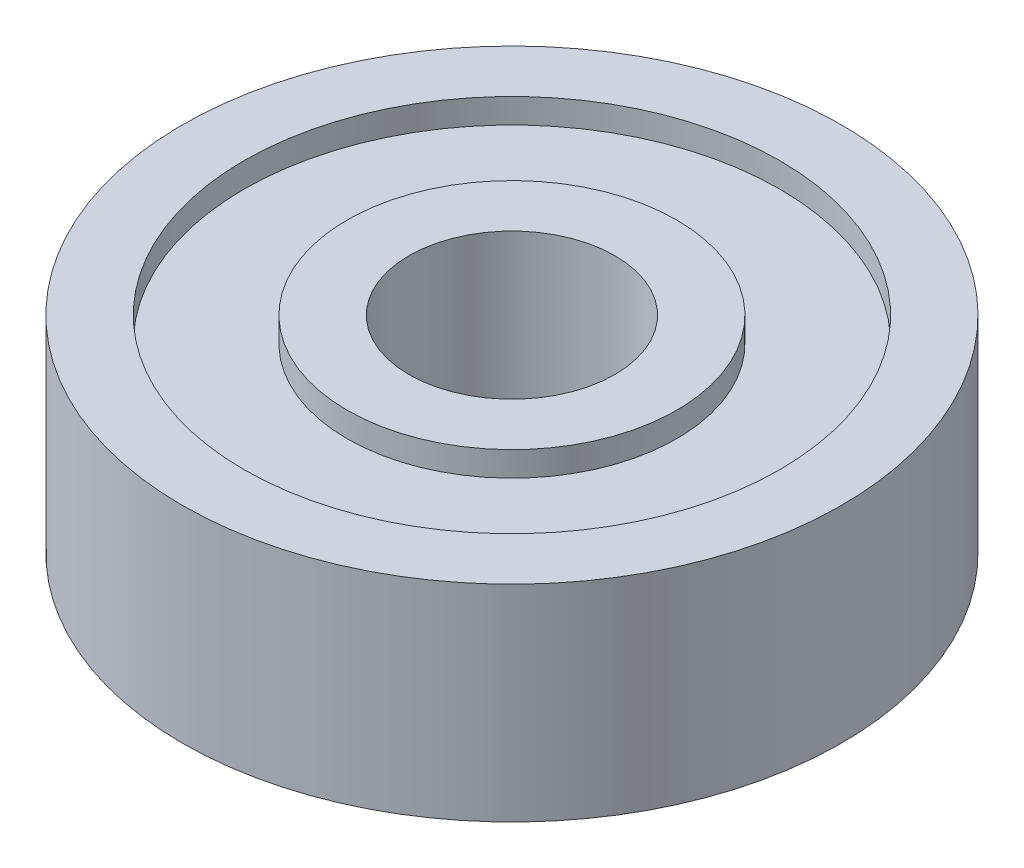
ISO-10303-21;
HEADER;
FILE_DESCRIPTION(('STEP AP214'),'2;1');
FILE_NAME('part.step','',(''),(''),'','','');
FILE_SCHEMA(('AUTOMOTIVE_DESIGN { 1 0 10303 214 1 1 1 1 }'));
ENDSEC;
DATA;
#1=APPLICATION_CONTEXT('core data for automotive mechanical design processes');
#2=APPLICATION_PROTOCOL_DEFINITION('international standard','automotive_design',2000,#1);
#3=PRODUCT_CONTEXT('',#1,'mechanical');
#4=PRODUCT('Part','Part','',(#3));
#5=PRODUCT_RELATED_PRODUCT_CATEGORY('part','',(#4));
#6=PRODUCT_DEFINITION_FORMATION('','',#4);
#7=PRODUCT_DEFINITION_CONTEXT('part definition',#1,'design');
#8=PRODUCT_DEFINITION('design','',#6,#7);
#9=PRODUCT_DEFINITION_SHAPE('','',#8);
#10=(LENGTH_UNIT() NAMED_UNIT(*) SI_UNIT(.MILLI.,.METRE.));
#11=(NAMED_UNIT(*) PLANE_ANGLE_UNIT() SI_UNIT($,.RADIAN.));
#12=(NAMED_UNIT(*) SI_UNIT($,.STERADIAN.) SOLID_ANGLE_UNIT());
#13=UNCERTAINTY_MEASURE_WITH_UNIT(LENGTH_MEASURE(1.E-05),#10,'distance_accuracy_value','');
#14=(GEOMETRIC_REPRESENTATION_CONTEXT(3) GLOBAL_UNCERTAINTY_ASSIGNED_CONTEXT((#13)) GLOBAL_UNIT_ASSIGNED_CONTEXT((#10,
#11,#12)) REPRESENTATION_CONTEXT('',''));
#15=CARTESIAN_POINT('',(0.,0.,0.));
#16=DIRECTION('',(0.,0.,1.));
#17=DIRECTION('',(1.,0.,0.));
#18=AXIS2_PLACEMENT_3D('',#15,#16,#17);
#19=CARTESIAN_POINT('',(0.,0.,0.));
#20=DIRECTION('',(0.,1.,0.));
#21=DIRECTION('',(0.,0.,1.));
#22=AXIS2_PLACEMENT_3D('',#19,#20,#21);
#23=PLANE('',#22);
#24=CARTESIAN_POINT('',(0.,0.,0.));
#25=DIRECTION('',(0.,1.,0.));
#26=DIRECTION('',(0.,0.,1.));
#27=AXIS2_PLACEMENT_3D('',#24,#25,#26);
#28=CIRCLE('',#27,2.5);
#29=CARTESIAN_POINT('',(0.,0.,2.5));
#30=VERTEX_POINT('',#29);
#31=EDGE_CURVE('E48',#30,#30,#28,.T.);
#32=ORIENTED_EDGE('',*,*,#31,.T.);
#33=EDGE_LOOP('',(#32));
#34=FACE_BOUND('',#33,.T.);
#35=CARTESIAN_POINT('',(0.,0.,0.));
#36=DIRECTION('',(0.,-1.,0.));
#37=DIRECTION('',(0.,0.,-1.));
#38=AXIS2_PLACEMENT_3D('',#35,#36,#37);
#39=CIRCLE('',#38,4.);
#40=CARTESIAN_POINT('',(0.,0.,-4.));
#41=VERTEX_POINT('',#40);
#42=EDGE_CURVE('E72',#41,#41,#39,.T.);
#43=ORIENTED_EDGE('',*,*,#42,.T.);
#44=EDGE_LOOP('',(#43));
#45=FACE_BOUND('',#44,.T.);
#46=ADVANCED_FACE('F35',(#34,#45),#23,.F.);
#47=CARTESIAN_POINT('',(0.,5.,0.));
#48=DIRECTION('',(0.,1.,0.));
#49=DIRECTION('',(0.,0.,1.));
#50=AXIS2_PLACEMENT_3D('',#47,#48,#49);
#51=PLANE('',#50);
#52=CARTESIAN_POINT('',(0.,5.,0.));
#53=DIRECTION('',(0.,1.,0.));
#54=DIRECTION('',(0.,0.,1.));
#55=AXIS2_PLACEMENT_3D('',#52,#53,#54);
#56=CIRCLE('',#55,2.5);
#57=CARTESIAN_POINT('',(0.,5.,2.5));
#58=VERTEX_POINT('',#57);
#59=EDGE_CURVE('E46',#58,#58,#56,.T.);
#60=ORIENTED_EDGE('',*,*,#59,.F.);
#61=EDGE_LOOP('',(#60));
#62=FACE_BOUND('',#61,.T.);
#63=CARTESIAN_POINT('',(0.,5.,0.));
#64=DIRECTION('',(0.,1.,0.));
#65=DIRECTION('',(0.,0.,1.));
#66=AXIS2_PLACEMENT_3D('',#63,#64,#65);
#67=CIRCLE('',#66,4.);
#68=CARTESIAN_POINT('',(0.,5.,4.));
#69=VERTEX_POINT('',#68);
#70=EDGE_CURVE('E60',#69,#69,#67,.T.);
#71=ORIENTED_EDGE('',*,*,#70,.T.);
#72=EDGE_LOOP('',(#71));
#73=FACE_BOUND('',#72,.T.);
#74=ADVANCED_FACE('F110',(#62,#73),#51,.T.);
#75=CARTESIAN_POINT('',(0.,5.,0.));
#76=DIRECTION('',(0.,1.,0.));
#77=DIRECTION('',(0.,0.,1.));
#78=AXIS2_PLACEMENT_3D('',#75,#76,#77);
#79=CIRCLE('',#78,6.5);
#80=CARTESIAN_POINT('',(0.,5.,6.5));
#81=VERTEX_POINT('',#80);
#82=EDGE_CURVE('E54',#81,#81,#79,.T.);
#83=ORIENTED_EDGE('',*,*,#82,.F.);
#84=EDGE_LOOP('',(#83));
#85=FACE_BOUND('',#84,.T.);
#86=CARTESIAN_POINT('',(0.,5.,0.));
#87=DIRECTION('',(0.,1.,0.));
#88=DIRECTION('',(0.,0.,1.));
#89=AXIS2_PLACEMENT_3D('',#86,#87,#88);
#90=CIRCLE('',#89,8.);
#91=CARTESIAN_POINT('',(0.,5.,8.));
#92=VERTEX_POINT('',#91);
#93=EDGE_CURVE('E10',#92,#92,#90,.T.);
#94=ORIENTED_EDGE('',*,*,#93,.T.);
#95=EDGE_LOOP('',(#94));
#96=FACE_BOUND('',#95,.T.);
#97=ADVANCED_FACE('F97',(#85,#96),#51,.T.);
#98=CARTESIAN_POINT('',(0.,0.,0.));
#99=DIRECTION('',(0.,-1.,0.));
#100=DIRECTION('',(0.,0.,-1.));
#101=AXIS2_PLACEMENT_3D('',#98,#99,#100);
#102=CIRCLE('',#101,6.5);
#103=CARTESIAN_POINT('',(0.,0.,-6.5));
#104=VERTEX_POINT('',#103);
#105=EDGE_CURVE('E66',#104,#104,#102,.T.);
#106=ORIENTED_EDGE('',*,*,#105,.F.);
#107=EDGE_LOOP('',(#106));
#108=FACE_BOUND('',#107,.T.);
#109=CARTESIAN_POINT('',(0.,0.,0.));
#110=DIRECTION('',(0.,1.,0.));
#111=DIRECTION('',(0.,0.,1.));
#112=AXIS2_PLACEMENT_3D('',#109,#110,#111);
#113=CIRCLE('',#112,8.);
#114=CARTESIAN_POINT('',(0.,0.,8.));
#115=VERTEX_POINT('',#114);
#116=EDGE_CURVE('E39',#115,#115,#113,.T.);
#117=ORIENTED_EDGE('',*,*,#116,.F.);
#118=EDGE_LOOP('',(#117));
#119=FACE_BOUND('',#118,.T.);
#120=ADVANCED_FACE('F94',(#108,#119),#23,.F.);
#121=CARTESIAN_POINT('',(0.,5.,0.));
#122=DIRECTION('',(0.,-1.,0.));
#123=DIRECTION('',(0.,0.,-1.));
#124=AXIS2_PLACEMENT_3D('',#121,#122,#123);
#125=CYLINDRICAL_SURFACE('',#124,8.);
#126=ORIENTED_EDGE('',*,*,#93,.F.);
#127=EDGE_LOOP('',(#126));
#128=FACE_BOUND('',#127,.T.);
#129=ORIENTED_EDGE('',*,*,#116,.T.);
#130=EDGE_LOOP('',(#129));
#131=FACE_BOUND('',#130,.T.);
#132=ADVANCED_FACE('F37',(#128,#131),#125,.T.);
#133=CARTESIAN_POINT('',(0.,5.,0.));
#134=DIRECTION('',(0.,-1.,0.));
#135=DIRECTION('',(0.,0.,-1.));
#136=AXIS2_PLACEMENT_3D('',#133,#134,#135);
#137=CYLINDRICAL_SURFACE('',#136,2.5);
#138=ORIENTED_EDGE('',*,*,#59,.T.);
#139=EDGE_LOOP('',(#138));
#140=FACE_BOUND('',#139,.T.);
#141=ORIENTED_EDGE('',*,*,#31,.F.);
#142=EDGE_LOOP('',(#141));
#143=FACE_BOUND('',#142,.T.);
#144=ADVANCED_FACE('F101',(#140,#143),#137,.F.);
#145=CARTESIAN_POINT('',(0.,4.4,0.));
#146=DIRECTION('',(0.,1.,0.));
#147=DIRECTION('',(0.,0.,1.));
#148=AXIS2_PLACEMENT_3D('',#145,#146,#147);
#149=CYLINDRICAL_SURFACE('',#148,6.5);
#150=CARTESIAN_POINT('',(0.,4.4,0.));
#151=DIRECTION('',(0.,1.,0.));
#152=DIRECTION('',(0.,0.,1.));
#153=AXIS2_PLACEMENT_3D('',#150,#151,#152);
#154=CIRCLE('',#153,6.5);
#155=CARTESIAN_POINT('',(0.,4.4,6.5));
#156=VERTEX_POINT('',#155);
#157=EDGE_CURVE('E51',#156,#156,#154,.T.);
#158=ORIENTED_EDGE('',*,*,#157,.F.);
#159=EDGE_LOOP('',(#158));
#160=FACE_BOUND('',#159,.T.);
#161=ORIENTED_EDGE('',*,*,#82,.T.);
#162=EDGE_LOOP('',(#161));
#163=FACE_BOUND('',#162,.T.);
#164=ADVANCED_FACE('F106',(#160,#163),#149,.F.);
#165=CARTESIAN_POINT('',(0.,4.4,0.));
#166=DIRECTION('',(0.,1.,0.));
#167=DIRECTION('',(0.,0.,1.));
#168=AXIS2_PLACEMENT_3D('',#165,#166,#167);
#169=PLANE('',#168);
#170=CARTESIAN_POINT('',(0.,4.4,0.));
#171=DIRECTION('',(0.,1.,0.));
#172=DIRECTION('',(0.,0.,1.));
#173=AXIS2_PLACEMENT_3D('',#170,#171,#172);
#174=CIRCLE('',#173,4.);
#175=CARTESIAN_POINT('',(0.,4.4,4.));
#176=VERTEX_POINT('',#175);
#177=EDGE_CURVE('E57',#176,#176,#174,.T.);
#178=ORIENTED_EDGE('',*,*,#177,.F.);
#179=EDGE_LOOP('',(#178));
#180=FACE_BOUND('',#179,.T.);
#181=ORIENTED_EDGE('',*,*,#157,.T.);
#182=EDGE_LOOP('',(#181));
#183=FACE_BOUND('',#182,.T.);
#184=ADVANCED_FACE('F123',(#180,#183),#169,.T.);
#185=CARTESIAN_POINT('',(0.,4.4,0.));
#186=DIRECTION('',(0.,1.,0.));
#187=DIRECTION('',(0.,0.,1.));
#188=AXIS2_PLACEMENT_3D('',#185,#186,#187);
#189=CYLINDRICAL_SURFACE('',#188,4.);
#190=ORIENTED_EDGE('',*,*,#177,.T.);
#191=EDGE_LOOP('',(#190));
#192=FACE_BOUND('',#191,.T.);
#193=ORIENTED_EDGE('',*,*,#70,.F.);
#194=EDGE_LOOP('',(#193));
#195=FACE_BOUND('',#194,.T.);
#196=ADVANCED_FACE('F90',(#192,#195),#189,.T.);
#197=CARTESIAN_POINT('',(0.,0.6,0.));
#198=DIRECTION('',(0.,-1.,0.));
#199=DIRECTION('',(0.,0.,-1.));
#200=AXIS2_PLACEMENT_3D('',#197,#198,#199);
#201=CYLINDRICAL_SURFACE('',#200,6.5);
#202=CARTESIAN_POINT('',(0.,0.6,0.));
#203=DIRECTION('',(0.,-1.,0.));
#204=DIRECTION('',(0.,0.,-1.));
#205=AXIS2_PLACEMENT_3D('',#202,#203,#204);
#206=CIRCLE('',#205,6.5);
#207=CARTESIAN_POINT('',(0.,0.6,-6.5));
#208=VERTEX_POINT('',#207);
#209=EDGE_CURVE('E63',#208,#208,#206,.T.);
#210=ORIENTED_EDGE('',*,*,#209,.F.);
#211=EDGE_LOOP('',(#210));
#212=FACE_BOUND('',#211,.T.);
#213=ORIENTED_EDGE('',*,*,#105,.T.);
#214=EDGE_LOOP('',(#213));
#215=FACE_BOUND('',#214,.T.);
#216=ADVANCED_FACE('F84',(#212,#215),#201,.F.);
#217=CARTESIAN_POINT('',(0.,0.6,0.));
#218=DIRECTION('',(0.,-1.,0.));
#219=DIRECTION('',(0.,0.,-1.));
#220=AXIS2_PLACEMENT_3D('',#217,#218,#219);
#221=PLANE('',#220);
#222=CARTESIAN_POINT('',(0.,0.6,0.));
#223=DIRECTION('',(0.,-1.,0.));
#224=DIRECTION('',(0.,0.,-1.));
#225=AXIS2_PLACEMENT_3D('',#222,#223,#224);
#226=CIRCLE('',#225,4.);
#227=CARTESIAN_POINT('',(0.,0.6,-4.));
#228=VERTEX_POINT('',#227);
#229=EDGE_CURVE('E69',#228,#228,#226,.T.);
#230=ORIENTED_EDGE('',*,*,#229,.F.);
#231=EDGE_LOOP('',(#230));
#232=FACE_BOUND('',#231,.T.);
#233=ORIENTED_EDGE('',*,*,#209,.T.);
#234=EDGE_LOOP('',(#233));
#235=FACE_BOUND('',#234,.T.);
#236=ADVANCED_FACE('F81',(#232,#235),#221,.T.);
#237=CARTESIAN_POINT('',(0.,0.6,0.));
#238=DIRECTION('',(0.,-1.,0.));
#239=DIRECTION('',(0.,0.,-1.));
#240=AXIS2_PLACEMENT_3D('',#237,#238,#239);
#241=CYLINDRICAL_SURFACE('',#240,4.);
#242=ORIENTED_EDGE('',*,*,#229,.T.);
#243=EDGE_LOOP('',(#242));
#244=FACE_BOUND('',#243,.T.);
#245=ORIENTED_EDGE('',*,*,#42,.F.);
#246=EDGE_LOOP('',(#245));
#247=FACE_BOUND('',#246,.T.);
#248=ADVANCED_FACE('F78',(#244,#247),#241,.T.);
#249=CLOSED_SHELL('',(#46,#74,#97,#120,#132,#144,#164,#184,#196,#216,#236,#248));
#250=MANIFOLD_SOLID_BREP('B2',#249);
#251=ADVANCED_BREP_SHAPE_REPRESENTATION('',(#18,#250),#14);
#252=SHAPE_DEFINITION_REPRESENTATION(#9,#251);
ENDSEC;
END-ISO-10303-21;
